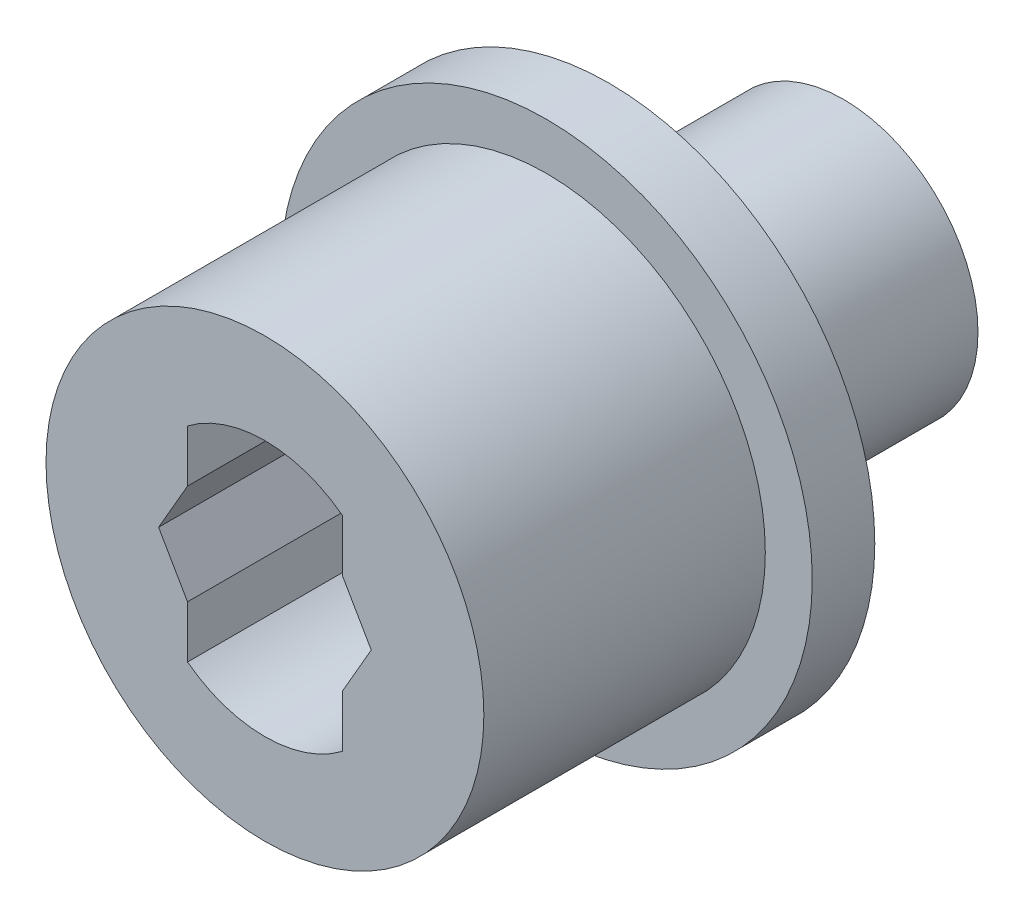
ISO-10303-21;
HEADER;
FILE_DESCRIPTION(('STEP AP214'),'2;1');
FILE_NAME('part.step','',(''),(''),'','','');
FILE_SCHEMA(('AUTOMOTIVE_DESIGN { 1 0 10303 214 1 1 1 1 }'));
ENDSEC;
DATA;
#1=APPLICATION_CONTEXT('core data for automotive mechanical design processes');
#2=APPLICATION_PROTOCOL_DEFINITION('international standard','automotive_design',2000,#1);
#3=PRODUCT_CONTEXT('',#1,'mechanical');
#4=PRODUCT('Part','Part','',(#3));
#5=PRODUCT_RELATED_PRODUCT_CATEGORY('part','',(#4));
#6=PRODUCT_DEFINITION_FORMATION('','',#4);
#7=PRODUCT_DEFINITION_CONTEXT('part definition',#1,'design');
#8=PRODUCT_DEFINITION('design','',#6,#7);
#9=PRODUCT_DEFINITION_SHAPE('','',#8);
#10=(LENGTH_UNIT() NAMED_UNIT(*) SI_UNIT(.MILLI.,.METRE.));
#11=(NAMED_UNIT(*) PLANE_ANGLE_UNIT() SI_UNIT($,.RADIAN.));
#12=(NAMED_UNIT(*) SI_UNIT($,.STERADIAN.) SOLID_ANGLE_UNIT());
#13=UNCERTAINTY_MEASURE_WITH_UNIT(LENGTH_MEASURE(1.E-05),#10,'distance_accuracy_value','');
#14=(GEOMETRIC_REPRESENTATION_CONTEXT(3) GLOBAL_UNCERTAINTY_ASSIGNED_CONTEXT((#13)) GLOBAL_UNIT_ASSIGNED_CONTEXT((#10,
#11,#12)) REPRESENTATION_CONTEXT('',''));
#15=CARTESIAN_POINT('',(0.,0.,0.));
#16=DIRECTION('',(0.,0.,1.));
#17=DIRECTION('',(1.,0.,0.));
#18=AXIS2_PLACEMENT_3D('',#15,#16,#17);
#19=CARTESIAN_POINT('',(2.475,0.,9.));
#20=DIRECTION('',(1.,0.,0.));
#21=DIRECTION('',(0.,0.,-1.));
#22=AXIS2_PLACEMENT_3D('',#19,#20,#21);
#23=PLANE('',#22);
#24=DIRECTION('',(0.,0.,1.));
#25=VECTOR('',#24,1.);
#26=CARTESIAN_POINT('',(2.475,-1.60214699700121,9.));
#27=LINE('',#26,#25);
#28=CARTESIAN_POINT('',(2.475,-1.60214699700121,0.));
#29=VERTEX_POINT('',#28);
#30=CARTESIAN_POINT('',(2.475,-1.60214699700121,9.));
#31=VERTEX_POINT('',#30);
#32=EDGE_CURVE('E134',#29,#31,#27,.T.);
#33=ORIENTED_EDGE('',*,*,#32,.F.);
#34=DIRECTION('',(0.,-1.,0.));
#35=VECTOR('',#34,1.);
#36=CARTESIAN_POINT('',(2.475,0.,0.));
#37=LINE('',#36,#35);
#38=CARTESIAN_POINT('',(2.475,-3.26869622326701,0.));
#39=VERTEX_POINT('',#38);
#40=EDGE_CURVE('E171',#29,#39,#37,.T.);
#41=ORIENTED_EDGE('',*,*,#40,.T.);
#42=DIRECTION('',(0.,0.,-1.));
#43=VECTOR('',#42,1.);
#44=CARTESIAN_POINT('',(2.475,-3.26869622326701,9.));
#45=LINE('',#44,#43);
#46=CARTESIAN_POINT('',(2.475,-3.26869622326701,9.));
#47=VERTEX_POINT('',#46);
#48=EDGE_CURVE('E42',#47,#39,#45,.T.);
#49=ORIENTED_EDGE('',*,*,#48,.F.);
#50=DIRECTION('',(0.,-1.,0.));
#51=VECTOR('',#50,1.);
#52=CARTESIAN_POINT('',(2.475,0.,9.));
#53=LINE('',#52,#51);
#54=EDGE_CURVE('E157',#31,#47,#53,.T.);
#55=ORIENTED_EDGE('',*,*,#54,.F.);
#56=EDGE_LOOP('',(#33,#41,#49,#55));
#57=FACE_BOUND('',#56,.T.);
#58=ADVANCED_FACE('F35',(#57),#23,.F.);
#59=DIRECTION('',(0.,0.,-1.));
#60=VECTOR('',#59,1.);
#61=CARTESIAN_POINT('',(2.475,1.60214699700121,9.));
#62=LINE('',#61,#60);
#63=CARTESIAN_POINT('',(2.475,1.60214699700121,9.));
#64=VERTEX_POINT('',#63);
#65=CARTESIAN_POINT('',(2.475,1.60214699700121,0.));
#66=VERTEX_POINT('',#65);
#67=EDGE_CURVE('E132',#64,#66,#62,.T.);
#68=ORIENTED_EDGE('',*,*,#67,.F.);
#69=CARTESIAN_POINT('',(2.475,3.26869622326701,9.));
#70=VERTEX_POINT('',#69);
#71=EDGE_CURVE('E159',#70,#64,#53,.T.);
#72=ORIENTED_EDGE('',*,*,#71,.F.);
#73=DIRECTION('',(0.,0.,-1.));
#74=VECTOR('',#73,1.);
#75=CARTESIAN_POINT('',(2.475,3.26869622326701,9.));
#76=LINE('',#75,#74);
#77=CARTESIAN_POINT('',(2.475,3.26869622326701,0.));
#78=VERTEX_POINT('',#77);
#79=EDGE_CURVE('E11',#70,#78,#76,.T.);
#80=ORIENTED_EDGE('',*,*,#79,.T.);
#81=EDGE_CURVE('E173',#78,#66,#37,.T.);
#82=ORIENTED_EDGE('',*,*,#81,.T.);
#83=EDGE_LOOP('',(#68,#72,#80,#82));
#84=FACE_BOUND('',#83,.T.);
#85=ADVANCED_FACE('F241',(#84),#23,.F.);
#86=CARTESIAN_POINT('',(-2.475,0.,9.));
#87=DIRECTION('',(1.,0.,0.));
#88=DIRECTION('',(0.,0.,-1.));
#89=AXIS2_PLACEMENT_3D('',#86,#87,#88);
#90=PLANE('',#89);
#91=DIRECTION('',(0.,-1.,0.));
#92=VECTOR('',#91,1.);
#93=CARTESIAN_POINT('',(-2.475,0.,9.));
#94=LINE('',#93,#92);
#95=CARTESIAN_POINT('',(-2.475,3.26869622326701,9.));
#96=VERTEX_POINT('',#95);
#97=CARTESIAN_POINT('',(-2.475,1.60214699700121,9.));
#98=VERTEX_POINT('',#97);
#99=EDGE_CURVE('E162',#96,#98,#94,.T.);
#100=ORIENTED_EDGE('',*,*,#99,.T.);
#101=DIRECTION('',(0.,0.,-1.));
#102=VECTOR('',#101,1.);
#103=CARTESIAN_POINT('',(-2.475,1.60214699700121,9.));
#104=LINE('',#103,#102);
#105=CARTESIAN_POINT('',(-2.475,1.60214699700121,0.));
#106=VERTEX_POINT('',#105);
#107=EDGE_CURVE('E142',#98,#106,#104,.T.);
#108=ORIENTED_EDGE('',*,*,#107,.T.);
#109=DIRECTION('',(0.,-1.,0.));
#110=VECTOR('',#109,1.);
#111=CARTESIAN_POINT('',(-2.475,0.,0.));
#112=LINE('',#111,#110);
#113=CARTESIAN_POINT('',(-2.475,3.26869622326701,0.));
#114=VERTEX_POINT('',#113);
#115=EDGE_CURVE('E118',#114,#106,#112,.T.);
#116=ORIENTED_EDGE('',*,*,#115,.F.);
#117=DIRECTION('',(0.,0.,-1.));
#118=VECTOR('',#117,1.);
#119=CARTESIAN_POINT('',(-2.475,3.26869622326701,9.));
#120=LINE('',#119,#118);
#121=EDGE_CURVE('E169',#96,#114,#120,.T.);
#122=ORIENTED_EDGE('',*,*,#121,.F.);
#123=EDGE_LOOP('',(#100,#108,#116,#122));
#124=FACE_BOUND('',#123,.T.);
#125=ADVANCED_FACE('F245',(#124),#90,.T.);
#126=CARTESIAN_POINT('',(-2.475,-1.60214699700121,0.));
#127=VERTEX_POINT('',#126);
#128=CARTESIAN_POINT('',(-2.475,-3.26869622326701,0.));
#129=VERTEX_POINT('',#128);
#130=EDGE_CURVE('E177',#127,#129,#112,.T.);
#131=ORIENTED_EDGE('',*,*,#130,.F.);
#132=DIRECTION('',(0.,0.,1.));
#133=VECTOR('',#132,1.);
#134=CARTESIAN_POINT('',(-2.475,-1.60214699700121,9.));
#135=LINE('',#134,#133);
#136=CARTESIAN_POINT('',(-2.475,-1.60214699700121,9.));
#137=VERTEX_POINT('',#136);
#138=EDGE_CURVE('E125',#127,#137,#135,.T.);
#139=ORIENTED_EDGE('',*,*,#138,.T.);
#140=CARTESIAN_POINT('',(-2.475,-3.26869622326701,9.));
#141=VERTEX_POINT('',#140);
#142=EDGE_CURVE('E166',#137,#141,#94,.T.);
#143=ORIENTED_EDGE('',*,*,#142,.T.);
#144=DIRECTION('',(0.,0.,-1.));
#145=VECTOR('',#144,1.);
#146=CARTESIAN_POINT('',(-2.475,-3.26869622326701,9.));
#147=LINE('',#146,#145);
#148=EDGE_CURVE('E179',#141,#129,#147,.T.);
#149=ORIENTED_EDGE('',*,*,#148,.T.);
#150=EDGE_LOOP('',(#131,#139,#143,#149));
#151=FACE_BOUND('',#150,.T.);
#152=ADVANCED_FACE('F194',(#151),#90,.T.);
#153=CARTESIAN_POINT('',(0.,0.,9.));
#154=DIRECTION('',(0.,0.,1.));
#155=DIRECTION('',(1.,0.,0.));
#156=AXIS2_PLACEMENT_3D('',#153,#154,#155);
#157=PLANE('',#156);
#158=CARTESIAN_POINT('',(0.,0.,9.));
#159=DIRECTION('',(0.,0.,1.));
#160=DIRECTION('',(1.,0.,0.));
#161=AXIS2_PLACEMENT_3D('',#158,#159,#160);
#162=CIRCLE('',#161,7.);
#163=CARTESIAN_POINT('',(7.,0.,9.));
#164=VERTEX_POINT('',#163);
#165=EDGE_CURVE('E165',#164,#164,#162,.T.);
#166=ORIENTED_EDGE('',*,*,#165,.T.);
#167=EDGE_LOOP('',(#166));
#168=FACE_BOUND('',#167,.T.);
#169=DIRECTION('',(0.5,-0.866025403784439,0.));
#170=VECTOR('',#169,1.);
#171=CARTESIAN_POINT('',(-3.4,0.,9.));
#172=LINE('',#171,#170);
#173=CARTESIAN_POINT('',(-3.4,0.,9.));
#174=VERTEX_POINT('',#173);
#175=EDGE_CURVE('E210',#174,#137,#172,.T.);
#176=ORIENTED_EDGE('',*,*,#175,.F.);
#177=DIRECTION('',(-0.5,-0.866025403784439,0.));
#178=VECTOR('',#177,1.);
#179=CARTESIAN_POINT('',(-1.7,2.94448637286709,9.));
#180=LINE('',#179,#178);
#181=EDGE_CURVE('E130',#98,#174,#180,.T.);
#182=ORIENTED_EDGE('',*,*,#181,.F.);
#183=ORIENTED_EDGE('',*,*,#99,.F.);
#184=CARTESIAN_POINT('',(0.,0.,9.));
#185=DIRECTION('',(0.,0.,1.));
#186=DIRECTION('',(1.,0.,0.));
#187=AXIS2_PLACEMENT_3D('',#184,#185,#186);
#188=CIRCLE('',#187,4.1);
#189=EDGE_CURVE('E154',#70,#96,#188,.T.);
#190=ORIENTED_EDGE('',*,*,#189,.F.);
#191=ORIENTED_EDGE('',*,*,#71,.T.);
#192=DIRECTION('',(-0.5,0.866025403784439,0.));
#193=VECTOR('',#192,1.);
#194=CARTESIAN_POINT('',(3.4,0.,9.));
#195=LINE('',#194,#193);
#196=CARTESIAN_POINT('',(3.4,0.,9.));
#197=VERTEX_POINT('',#196);
#198=EDGE_CURVE('E136',#197,#64,#195,.T.);
#199=ORIENTED_EDGE('',*,*,#198,.F.);
#200=DIRECTION('',(0.5,0.866025403784439,0.));
#201=VECTOR('',#200,1.);
#202=CARTESIAN_POINT('',(1.7,-2.94448637286709,9.));
#203=LINE('',#202,#201);
#204=EDGE_CURVE('E200',#31,#197,#203,.T.);
#205=ORIENTED_EDGE('',*,*,#204,.F.);
#206=ORIENTED_EDGE('',*,*,#54,.T.);
#207=EDGE_CURVE('E158',#141,#47,#188,.T.);
#208=ORIENTED_EDGE('',*,*,#207,.F.);
#209=ORIENTED_EDGE('',*,*,#142,.F.);
#210=EDGE_LOOP('',(#176,#182,#183,#190,#191,#199,#205,#206,#208,#209));
#211=FACE_BOUND('',#210,.T.);
#212=ADVANCED_FACE('F197',(#168,#211),#157,.T.);
#213=CARTESIAN_POINT('',(0.,0.,9.));
#214=DIRECTION('',(0.,0.,-1.));
#215=DIRECTION('',(-1.,0.,0.));
#216=AXIS2_PLACEMENT_3D('',#213,#214,#215);
#217=CYLINDRICAL_SURFACE('',#216,4.1);
#218=CARTESIAN_POINT('',(0.,0.,0.));
#219=DIRECTION('',(0.,0.,1.));
#220=DIRECTION('',(1.,0.,0.));
#221=AXIS2_PLACEMENT_3D('',#218,#219,#220);
#222=CIRCLE('',#221,4.1);
#223=EDGE_CURVE('E153',#78,#114,#222,.T.);
#224=ORIENTED_EDGE('',*,*,#223,.F.);
#225=ORIENTED_EDGE('',*,*,#79,.F.);
#226=ORIENTED_EDGE('',*,*,#189,.T.);
#227=ORIENTED_EDGE('',*,*,#121,.T.);
#228=EDGE_LOOP('',(#224,#225,#226,#227));
#229=FACE_BOUND('',#228,.T.);
#230=ADVANCED_FACE('F259',(#229),#217,.F.);
#231=EDGE_CURVE('E172',#129,#39,#222,.T.);
#232=ORIENTED_EDGE('',*,*,#231,.F.);
#233=ORIENTED_EDGE('',*,*,#148,.F.);
#234=ORIENTED_EDGE('',*,*,#207,.T.);
#235=ORIENTED_EDGE('',*,*,#48,.T.);
#236=EDGE_LOOP('',(#232,#233,#234,#235));
#237=FACE_BOUND('',#236,.T.);
#238=ADVANCED_FACE('F187',(#237),#217,.F.);
#239=CARTESIAN_POINT('',(0.,0.,9.));
#240=DIRECTION('',(0.,0.,-1.));
#241=DIRECTION('',(-1.,0.,0.));
#242=AXIS2_PLACEMENT_3D('',#239,#240,#241);
#243=CYLINDRICAL_SURFACE('',#242,7.);
#244=ORIENTED_EDGE('',*,*,#165,.F.);
#245=EDGE_LOOP('',(#244));
#246=FACE_BOUND('',#245,.T.);
#247=CARTESIAN_POINT('',(0.,0.,0.));
#248=DIRECTION('',(0.,0.,-1.));
#249=DIRECTION('',(-1.,0.,0.));
#250=AXIS2_PLACEMENT_3D('',#247,#248,#249);
#251=CIRCLE('',#250,7.);
#252=CARTESIAN_POINT('',(-7.,0.,0.));
#253=VERTEX_POINT('',#252);
#254=EDGE_CURVE('E148',#253,#253,#251,.T.);
#255=ORIENTED_EDGE('',*,*,#254,.F.);
#256=EDGE_LOOP('',(#255));
#257=FACE_BOUND('',#256,.T.);
#258=ADVANCED_FACE('F282',(#246,#257),#243,.T.);
#259=CARTESIAN_POINT('',(0.,0.,0.));
#260=DIRECTION('',(0.,0.,-1.));
#261=DIRECTION('',(-1.,0.,0.));
#262=AXIS2_PLACEMENT_3D('',#259,#260,#261);
#263=PLANE('',#262);
#264=ORIENTED_EDGE('',*,*,#254,.T.);
#265=EDGE_LOOP('',(#264));
#266=FACE_BOUND('',#265,.T.);
#267=CARTESIAN_POINT('',(0.,0.,0.));
#268=DIRECTION('',(0.,0.,-1.));
#269=DIRECTION('',(-1.,0.,0.));
#270=AXIS2_PLACEMENT_3D('',#267,#268,#269);
#271=CIRCLE('',#270,8.5);
#272=CARTESIAN_POINT('',(-8.5,0.,0.));
#273=VERTEX_POINT('',#272);
#274=EDGE_CURVE('E144',#273,#273,#271,.T.);
#275=ORIENTED_EDGE('',*,*,#274,.F.);
#276=EDGE_LOOP('',(#275));
#277=FACE_BOUND('',#276,.T.);
#278=ADVANCED_FACE('F270',(#266,#277),#263,.F.);
#279=CARTESIAN_POINT('',(0.,0.,-2.));
#280=DIRECTION('',(0.,0.,-1.));
#281=DIRECTION('',(-1.,0.,0.));
#282=AXIS2_PLACEMENT_3D('',#279,#280,#281);
#283=PLANE('',#282);
#284=CARTESIAN_POINT('',(0.,0.,-2.));
#285=DIRECTION('',(0.,0.,-1.));
#286=DIRECTION('',(-1.,0.,0.));
#287=AXIS2_PLACEMENT_3D('',#284,#285,#286);
#288=CIRCLE('',#287,4.3);
#289=CARTESIAN_POINT('',(-4.3,0.,-2.));
#290=VERTEX_POINT('',#289);
#291=EDGE_CURVE('E213',#290,#290,#288,.T.);
#292=ORIENTED_EDGE('',*,*,#291,.F.);
#293=EDGE_LOOP('',(#292));
#294=FACE_BOUND('',#293,.T.);
#295=CARTESIAN_POINT('',(0.,0.,-2.));
#296=DIRECTION('',(0.,0.,-1.));
#297=DIRECTION('',(-1.,0.,0.));
#298=AXIS2_PLACEMENT_3D('',#295,#296,#297);
#299=CIRCLE('',#298,8.5);
#300=CARTESIAN_POINT('',(-8.5,0.,-2.));
#301=VERTEX_POINT('',#300);
#302=EDGE_CURVE('E145',#301,#301,#299,.T.);
#303=ORIENTED_EDGE('',*,*,#302,.T.);
#304=EDGE_LOOP('',(#303));
#305=FACE_BOUND('',#304,.T.);
#306=ADVANCED_FACE('F277',(#294,#305),#283,.T.);
#307=CARTESIAN_POINT('',(0.,0.,-2.));
#308=DIRECTION('',(0.,0.,1.));
#309=DIRECTION('',(1.,0.,0.));
#310=AXIS2_PLACEMENT_3D('',#307,#308,#309);
#311=CYLINDRICAL_SURFACE('',#310,8.5);
#312=ORIENTED_EDGE('',*,*,#302,.F.);
#313=EDGE_LOOP('',(#312));
#314=FACE_BOUND('',#313,.T.);
#315=ORIENTED_EDGE('',*,*,#274,.T.);
#316=EDGE_LOOP('',(#315));
#317=FACE_BOUND('',#316,.T.);
#318=ADVANCED_FACE('F268',(#314,#317),#311,.T.);
#319=ORIENTED_EDGE('',*,*,#115,.T.);
#320=DIRECTION('',(-0.5,-0.866025403784439,0.));
#321=VECTOR('',#320,1.);
#322=CARTESIAN_POINT('',(-1.7,2.94448637286709,0.));
#323=LINE('',#322,#321);
#324=CARTESIAN_POINT('',(-3.4,0.,0.));
#325=VERTEX_POINT('',#324);
#326=EDGE_CURVE('E112',#106,#325,#323,.T.);
#327=ORIENTED_EDGE('',*,*,#326,.T.);
#328=DIRECTION('',(0.5,-0.866025403784439,0.));
#329=VECTOR('',#328,1.);
#330=CARTESIAN_POINT('',(-3.4,0.,0.));
#331=LINE('',#330,#329);
#332=EDGE_CURVE('E114',#325,#127,#331,.T.);
#333=ORIENTED_EDGE('',*,*,#332,.T.);
#334=ORIENTED_EDGE('',*,*,#130,.T.);
#335=ORIENTED_EDGE('',*,*,#231,.T.);
#336=ORIENTED_EDGE('',*,*,#40,.F.);
#337=DIRECTION('',(0.5,0.866025403784439,0.));
#338=VECTOR('',#337,1.);
#339=CARTESIAN_POINT('',(1.7,-2.94448637286709,0.));
#340=LINE('',#339,#338);
#341=CARTESIAN_POINT('',(3.4,0.,0.));
#342=VERTEX_POINT('',#341);
#343=EDGE_CURVE('E126',#29,#342,#340,.T.);
#344=ORIENTED_EDGE('',*,*,#343,.T.);
#345=DIRECTION('',(-0.5,0.866025403784439,0.));
#346=VECTOR('',#345,1.);
#347=CARTESIAN_POINT('',(3.4,0.,0.));
#348=LINE('',#347,#346);
#349=EDGE_CURVE('E205',#342,#66,#348,.T.);
#350=ORIENTED_EDGE('',*,*,#349,.T.);
#351=ORIENTED_EDGE('',*,*,#81,.F.);
#352=ORIENTED_EDGE('',*,*,#223,.T.);
#353=EDGE_LOOP('',(#319,#327,#333,#334,#335,#336,#344,#350,#351,#352));
#354=FACE_BOUND('',#353,.T.);
#355=ADVANCED_FACE('F113',(#354),#263,.F.);
#356=CARTESIAN_POINT('',(3.4,0.,9.));
#357=DIRECTION('',(-0.866025403784439,-0.5,0.));
#358=DIRECTION('',(0.5,-0.866025403784439,0.));
#359=AXIS2_PLACEMENT_3D('',#356,#357,#358);
#360=PLANE('',#359);
#361=ORIENTED_EDGE('',*,*,#67,.T.);
#362=ORIENTED_EDGE('',*,*,#349,.F.);
#363=DIRECTION('',(0.,0.,-1.));
#364=VECTOR('',#363,1.);
#365=CARTESIAN_POINT('',(3.4,0.,9.));
#366=LINE('',#365,#364);
#367=EDGE_CURVE('E57',#197,#342,#366,.T.);
#368=ORIENTED_EDGE('',*,*,#367,.F.);
#369=ORIENTED_EDGE('',*,*,#198,.T.);
#370=EDGE_LOOP('',(#361,#362,#368,#369));
#371=FACE_BOUND('',#370,.T.);
#372=ADVANCED_FACE('F260',(#371),#360,.T.);
#373=CARTESIAN_POINT('',(1.7,-2.94448637286709,9.));
#374=DIRECTION('',(-0.866025403784439,0.5,0.));
#375=DIRECTION('',(-0.5,-0.866025403784439,0.));
#376=AXIS2_PLACEMENT_3D('',#373,#374,#375);
#377=PLANE('',#376);
#378=ORIENTED_EDGE('',*,*,#32,.T.);
#379=ORIENTED_EDGE('',*,*,#204,.T.);
#380=ORIENTED_EDGE('',*,*,#367,.T.);
#381=ORIENTED_EDGE('',*,*,#343,.F.);
#382=EDGE_LOOP('',(#378,#379,#380,#381));
#383=FACE_BOUND('',#382,.T.);
#384=ADVANCED_FACE('F203',(#383),#377,.T.);
#385=CARTESIAN_POINT('',(-1.7,2.94448637286709,9.));
#386=DIRECTION('',(0.866025403784439,-0.5,0.));
#387=DIRECTION('',(0.5,0.866025403784439,0.));
#388=AXIS2_PLACEMENT_3D('',#385,#386,#387);
#389=PLANE('',#388);
#390=ORIENTED_EDGE('',*,*,#181,.T.);
#391=DIRECTION('',(0.,0.,-1.));
#392=VECTOR('',#391,1.);
#393=CARTESIAN_POINT('',(-3.4,0.,9.));
#394=LINE('',#393,#392);
#395=EDGE_CURVE('E49',#174,#325,#394,.T.);
#396=ORIENTED_EDGE('',*,*,#395,.T.);
#397=ORIENTED_EDGE('',*,*,#326,.F.);
#398=ORIENTED_EDGE('',*,*,#107,.F.);
#399=EDGE_LOOP('',(#390,#396,#397,#398));
#400=FACE_BOUND('',#399,.T.);
#401=ADVANCED_FACE('F128',(#400),#389,.T.);
#402=CARTESIAN_POINT('',(-3.4,0.,9.));
#403=DIRECTION('',(0.866025403784439,0.5,0.));
#404=DIRECTION('',(-0.5,0.866025403784439,0.));
#405=AXIS2_PLACEMENT_3D('',#402,#403,#404);
#406=PLANE('',#405);
#407=ORIENTED_EDGE('',*,*,#332,.F.);
#408=ORIENTED_EDGE('',*,*,#395,.F.);
#409=ORIENTED_EDGE('',*,*,#175,.T.);
#410=ORIENTED_EDGE('',*,*,#138,.F.);
#411=EDGE_LOOP('',(#407,#408,#409,#410));
#412=FACE_BOUND('',#411,.T.);
#413=ADVANCED_FACE('F123',(#412),#406,.T.);
#414=CARTESIAN_POINT('',(0.,0.,-9.5));
#415=DIRECTION('',(0.,0.,1.));
#416=DIRECTION('',(1.,0.,0.));
#417=AXIS2_PLACEMENT_3D('',#414,#415,#416);
#418=CYLINDRICAL_SURFACE('',#417,4.3);
#419=CARTESIAN_POINT('',(0.,0.,-9.5));
#420=DIRECTION('',(0.,0.,-1.));
#421=DIRECTION('',(-1.,0.,0.));
#422=AXIS2_PLACEMENT_3D('',#419,#420,#421);
#423=CIRCLE('',#422,4.3);
#424=CARTESIAN_POINT('',(-4.3,0.,-9.5));
#425=VERTEX_POINT('',#424);
#426=EDGE_CURVE('E121',#425,#425,#423,.T.);
#427=ORIENTED_EDGE('',*,*,#426,.F.);
#428=EDGE_LOOP('',(#427));
#429=FACE_BOUND('',#428,.T.);
#430=ORIENTED_EDGE('',*,*,#291,.T.);
#431=EDGE_LOOP('',(#430));
#432=FACE_BOUND('',#431,.T.);
#433=ADVANCED_FACE('F237',(#429,#432),#418,.T.);
#434=CARTESIAN_POINT('',(0.,0.,-9.5));
#435=DIRECTION('',(0.,0.,-1.));
#436=DIRECTION('',(-1.,0.,0.));
#437=AXIS2_PLACEMENT_3D('',#434,#435,#436);
#438=PLANE('',#437);
#439=CARTESIAN_POINT('',(0.,0.,-9.5));
#440=DIRECTION('',(0.,0.,-1.));
#441=DIRECTION('',(-1.,0.,0.));
#442=AXIS2_PLACEMENT_3D('',#439,#440,#441);
#443=CIRCLE('',#442,3.45);
#444=CARTESIAN_POINT('',(-3.45,0.,-9.5));
#445=VERTEX_POINT('',#444);
#446=EDGE_CURVE('E216',#445,#445,#443,.T.);
#447=ORIENTED_EDGE('',*,*,#446,.F.);
#448=EDGE_LOOP('',(#447));
#449=FACE_BOUND('',#448,.T.);
#450=ORIENTED_EDGE('',*,*,#426,.T.);
#451=EDGE_LOOP('',(#450));
#452=FACE_BOUND('',#451,.T.);
#453=ADVANCED_FACE('F229',(#449,#452),#438,.T.);
#454=CARTESIAN_POINT('',(0.,0.,-9.5));
#455=DIRECTION('',(0.,0.,1.));
#456=DIRECTION('',(1.,0.,0.));
#457=AXIS2_PLACEMENT_3D('',#454,#455,#456);
#458=CYLINDRICAL_SURFACE('',#457,3.45);
#459=ORIENTED_EDGE('',*,*,#446,.T.);
#460=EDGE_LOOP('',(#459));
#461=FACE_BOUND('',#460,.T.);
#462=CARTESIAN_POINT('',(0.,0.,-1.));
#463=DIRECTION('',(0.,0.,-1.));
#464=DIRECTION('',(-1.,0.,0.));
#465=AXIS2_PLACEMENT_3D('',#462,#463,#464);
#466=CIRCLE('',#465,3.45);
#467=CARTESIAN_POINT('',(-3.45,0.,-1.));
#468=VERTEX_POINT('',#467);
#469=EDGE_CURVE('E221',#468,#468,#466,.T.);
#470=ORIENTED_EDGE('',*,*,#469,.F.);
#471=EDGE_LOOP('',(#470));
#472=FACE_BOUND('',#471,.T.);
#473=ADVANCED_FACE('F227',(#461,#472),#458,.F.);
#474=CARTESIAN_POINT('',(0.,0.,-1.));
#475=DIRECTION('',(0.,0.,-1.));
#476=DIRECTION('',(-1.,0.,0.));
#477=AXIS2_PLACEMENT_3D('',#474,#475,#476);
#478=PLANE('',#477);
#479=ORIENTED_EDGE('',*,*,#469,.T.);
#480=EDGE_LOOP('',(#479));
#481=FACE_BOUND('',#480,.T.);
#482=ADVANCED_FACE('F225',(#481),#478,.T.);
#483=CLOSED_SHELL('',(#58,#85,#125,#152,#212,#230,#238,#258,#278,#306,#318,#355,#372,#384,#401,
#413,#433,#453,#473,#482));
#484=MANIFOLD_SOLID_BREP('B2',#483);
#485=ADVANCED_BREP_SHAPE_REPRESENTATION('',(#18,#484),#14);
#486=SHAPE_DEFINITION_REPRESENTATION(#9,#485);
ENDSEC;
END-ISO-10303-21;
